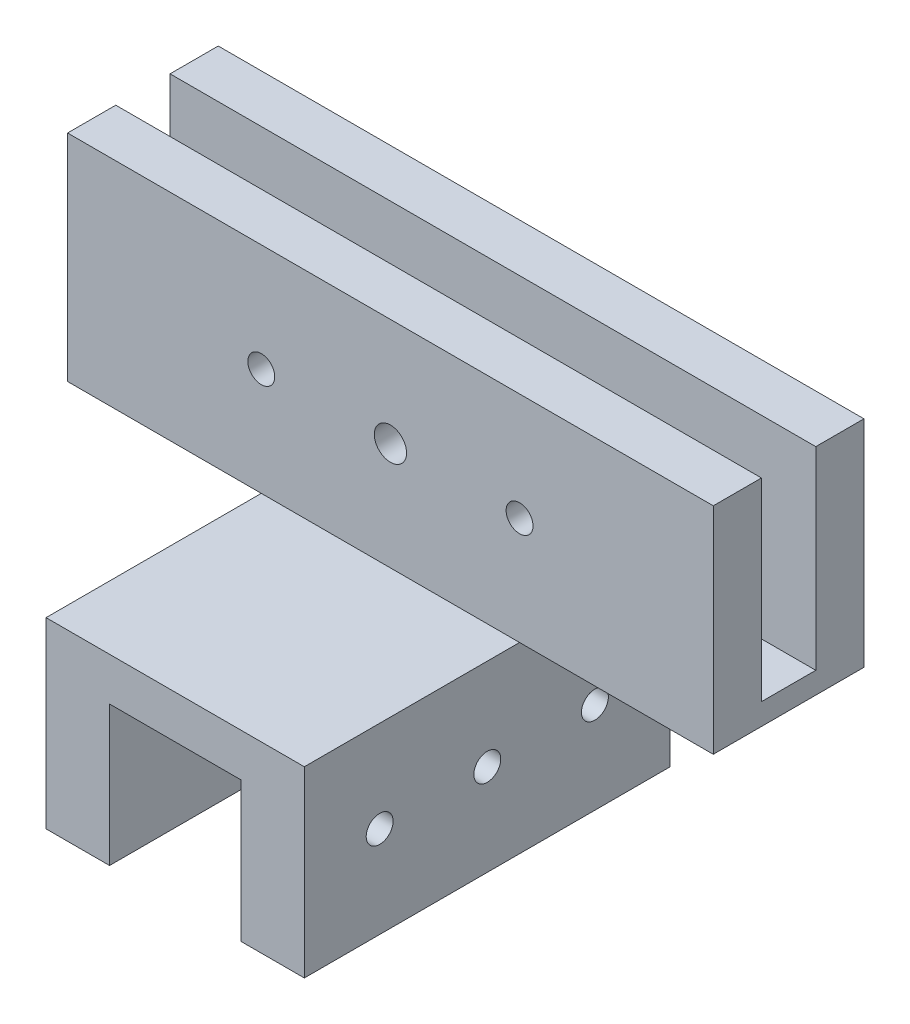
ISO-10303-21;
HEADER;
FILE_DESCRIPTION(('STEP AP214'),'2;1');
FILE_NAME('part.step','',(''),(''),'','','');
FILE_SCHEMA(('AUTOMOTIVE_DESIGN { 1 0 10303 214 1 1 1 1 }'));
ENDSEC;
DATA;
#1=APPLICATION_CONTEXT('core data for automotive mechanical design processes');
#2=APPLICATION_PROTOCOL_DEFINITION('international standard','automotive_design',2000,#1);
#3=PRODUCT_CONTEXT('',#1,'mechanical');
#4=PRODUCT('Part','Part','',(#3));
#5=PRODUCT_RELATED_PRODUCT_CATEGORY('part','',(#4));
#6=PRODUCT_DEFINITION_FORMATION('','',#4);
#7=PRODUCT_DEFINITION_CONTEXT('part definition',#1,'design');
#8=PRODUCT_DEFINITION('design','',#6,#7);
#9=PRODUCT_DEFINITION_SHAPE('','',#8);
#10=(LENGTH_UNIT() NAMED_UNIT(*) SI_UNIT(.MILLI.,.METRE.));
#11=(NAMED_UNIT(*) PLANE_ANGLE_UNIT() SI_UNIT($,.RADIAN.));
#12=(NAMED_UNIT(*) SI_UNIT($,.STERADIAN.) SOLID_ANGLE_UNIT());
#13=UNCERTAINTY_MEASURE_WITH_UNIT(LENGTH_MEASURE(1.E-05),#10,'distance_accuracy_value','');
#14=(GEOMETRIC_REPRESENTATION_CONTEXT(3) GLOBAL_UNCERTAINTY_ASSIGNED_CONTEXT((#13)) GLOBAL_UNIT_ASSIGNED_CONTEXT((#10,
#11,#12)) REPRESENTATION_CONTEXT('',''));
#15=CARTESIAN_POINT('',(0.,0.,0.));
#16=DIRECTION('',(0.,0.,1.));
#17=DIRECTION('',(1.,0.,0.));
#18=AXIS2_PLACEMENT_3D('',#15,#16,#17);
#19=CARTESIAN_POINT('',(0.,0.,0.));
#20=DIRECTION('',(0.,0.,-1.));
#21=DIRECTION('',(-1.,0.,0.));
#22=AXIS2_PLACEMENT_3D('',#19,#20,#21);
#23=PLANE('',#22);
#24=CARTESIAN_POINT('',(0.,7.,0.));
#25=DIRECTION('',(0.,0.,1.));
#26=DIRECTION('',(1.,0.,0.));
#27=AXIS2_PLACEMENT_3D('',#24,#25,#26);
#28=CIRCLE('',#27,0.75);
#29=CARTESIAN_POINT('',(0.75,7.,0.));
#30=VERTEX_POINT('',#29);
#31=EDGE_CURVE('E663',#30,#30,#28,.T.);
#32=ORIENTED_EDGE('',*,*,#31,.F.);
#33=EDGE_LOOP('',(#32));
#34=FACE_BOUND('',#33,.T.);
#35=CARTESIAN_POINT('',(6.,7.,0.));
#36=DIRECTION('',(0.,0.,1.));
#37=DIRECTION('',(1.,0.,0.));
#38=AXIS2_PLACEMENT_3D('',#35,#36,#37);
#39=CIRCLE('',#38,0.625);
#40=CARTESIAN_POINT('',(6.625,7.,0.));
#41=VERTEX_POINT('',#40);
#42=EDGE_CURVE('E634',#41,#41,#39,.T.);
#43=ORIENTED_EDGE('',*,*,#42,.F.);
#44=EDGE_LOOP('',(#43));
#45=FACE_BOUND('',#44,.T.);
#46=DIRECTION('',(1.,0.,0.));
#47=VECTOR('',#46,1.);
#48=CARTESIAN_POINT('',(-15.,12.,0.));
#49=LINE('',#48,#47);
#50=CARTESIAN_POINT('',(-15.,12.,0.));
#51=VERTEX_POINT('',#50);
#52=CARTESIAN_POINT('',(15.,12.,0.));
#53=VERTEX_POINT('',#52);
#54=EDGE_CURVE('E190',#51,#53,#49,.T.);
#55=ORIENTED_EDGE('',*,*,#54,.F.);
#56=DIRECTION('',(0.,-1.,0.));
#57=VECTOR('',#56,1.);
#58=CARTESIAN_POINT('',(-15.,12.,0.));
#59=LINE('',#58,#57);
#60=CARTESIAN_POINT('',(-15.,1.99999999999999,0.));
#61=VERTEX_POINT('',#60);
#62=EDGE_CURVE('E199',#51,#61,#59,.T.);
#63=ORIENTED_EDGE('',*,*,#62,.T.);
#64=DIRECTION('',(1.,0.,0.));
#65=VECTOR('',#64,1.);
#66=CARTESIAN_POINT('',(-15.,1.99999999999999,0.));
#67=LINE('',#66,#65);
#68=CARTESIAN_POINT('',(-6.00000000000001,1.99999999999999,0.));
#69=VERTEX_POINT('',#68);
#70=EDGE_CURVE('E46',#61,#69,#67,.T.);
#71=ORIENTED_EDGE('',*,*,#70,.T.);
#72=CARTESIAN_POINT('',(6.,2.,0.));
#73=VERTEX_POINT('',#72);
#74=EDGE_CURVE('E11',#69,#73,#67,.T.);
#75=ORIENTED_EDGE('',*,*,#74,.T.);
#76=CARTESIAN_POINT('',(15.,2.,0.));
#77=VERTEX_POINT('',#76);
#78=EDGE_CURVE('E47',#73,#77,#67,.T.);
#79=ORIENTED_EDGE('',*,*,#78,.T.);
#80=DIRECTION('',(0.,-1.,0.));
#81=VECTOR('',#80,1.);
#82=CARTESIAN_POINT('',(15.,12.,0.));
#83=LINE('',#82,#81);
#84=EDGE_CURVE('E212',#53,#77,#83,.T.);
#85=ORIENTED_EDGE('',*,*,#84,.F.);
#86=EDGE_LOOP('',(#55,#63,#71,#75,#79,#85));
#87=FACE_BOUND('',#86,.T.);
#88=CARTESIAN_POINT('',(-6.00000000000001,7.,0.));
#89=DIRECTION('',(0.,0.,1.));
#90=DIRECTION('',(1.,0.,0.));
#91=AXIS2_PLACEMENT_3D('',#88,#89,#90);
#92=CIRCLE('',#91,0.625);
#93=CARTESIAN_POINT('',(-5.37500000000001,7.,0.));
#94=VERTEX_POINT('',#93);
#95=EDGE_CURVE('E631',#94,#94,#92,.T.);
#96=ORIENTED_EDGE('',*,*,#95,.F.);
#97=EDGE_LOOP('',(#96));
#98=FACE_BOUND('',#97,.T.);
#99=ADVANCED_FACE('F35',(#34,#45,#87,#98),#23,.F.);
#100=CARTESIAN_POINT('',(-15.,12.,-7.));
#101=DIRECTION('',(0.,-1.,0.));
#102=DIRECTION('',(1.,0.,0.));
#103=AXIS2_PLACEMENT_3D('',#100,#101,#102);
#104=PLANE('',#103);
#105=DIRECTION('',(0.,0.,1.));
#106=VECTOR('',#105,1.);
#107=CARTESIAN_POINT('',(-15.,12.,-7.));
#108=LINE('',#107,#106);
#109=CARTESIAN_POINT('',(-15.,12.,-7.));
#110=VERTEX_POINT('',#109);
#111=CARTESIAN_POINT('',(-15.,12.,-4.76148716506941));
#112=VERTEX_POINT('',#111);
#113=EDGE_CURVE('E218',#110,#112,#108,.T.);
#114=ORIENTED_EDGE('',*,*,#113,.T.);
#115=DIRECTION('',(-1.,0.,0.));
#116=VECTOR('',#115,1.);
#117=CARTESIAN_POINT('',(15.,12.,-4.76148716506941));
#118=LINE('',#117,#116);
#119=CARTESIAN_POINT('',(15.,12.,-4.76148716506941));
#120=VERTEX_POINT('',#119);
#121=EDGE_CURVE('E188',#120,#112,#118,.T.);
#122=ORIENTED_EDGE('',*,*,#121,.F.);
#123=DIRECTION('',(0.,0.,1.));
#124=VECTOR('',#123,1.);
#125=CARTESIAN_POINT('',(15.,12.,-7.));
#126=LINE('',#125,#124);
#127=CARTESIAN_POINT('',(15.,12.,-7.));
#128=VERTEX_POINT('',#127);
#129=EDGE_CURVE('E176',#128,#120,#126,.T.);
#130=ORIENTED_EDGE('',*,*,#129,.F.);
#131=DIRECTION('',(1.,0.,0.));
#132=VECTOR('',#131,1.);
#133=CARTESIAN_POINT('',(-15.,12.,-7.));
#134=LINE('',#133,#132);
#135=EDGE_CURVE('E195',#110,#128,#134,.T.);
#136=ORIENTED_EDGE('',*,*,#135,.F.);
#137=EDGE_LOOP('',(#114,#122,#130,#136));
#138=FACE_BOUND('',#137,.T.);
#139=ADVANCED_FACE('F340',(#138),#104,.F.);
#140=CARTESIAN_POINT('',(0.,1.99999999999999,-7.));
#141=DIRECTION('',(0.,-1.,0.));
#142=DIRECTION('',(0.,0.,-1.));
#143=AXIS2_PLACEMENT_3D('',#140,#141,#142);
#144=PLANE('',#143);
#145=ORIENTED_EDGE('',*,*,#74,.F.);
#146=DIRECTION('',(0.,0.,1.));
#147=VECTOR('',#146,1.);
#148=CARTESIAN_POINT('',(-6.00000000000001,1.99999999999999,-7.));
#149=LINE('',#148,#147);
#150=CARTESIAN_POINT('',(-6.00000000000001,1.99999999999999,10.));
#151=VERTEX_POINT('',#150);
#152=EDGE_CURVE('E270',#69,#151,#149,.T.);
#153=ORIENTED_EDGE('',*,*,#152,.T.);
#154=DIRECTION('',(1.,0.,0.));
#155=VECTOR('',#154,1.);
#156=CARTESIAN_POINT('',(0.,1.99999999999999,10.));
#157=LINE('',#156,#155);
#158=CARTESIAN_POINT('',(5.99999999999999,1.99999999999999,10.));
#159=VERTEX_POINT('',#158);
#160=EDGE_CURVE('E228',#151,#159,#157,.T.);
#161=ORIENTED_EDGE('',*,*,#160,.T.);
#162=DIRECTION('',(0.,0.,1.));
#163=VECTOR('',#162,1.);
#164=CARTESIAN_POINT('',(5.99999999999999,1.99999999999999,-7.));
#165=LINE('',#164,#163);
#166=EDGE_CURVE('E272',#73,#159,#165,.T.);
#167=ORIENTED_EDGE('',*,*,#166,.F.);
#168=EDGE_LOOP('',(#145,#153,#161,#167));
#169=FACE_BOUND('',#168,.T.);
#170=ADVANCED_FACE('F37',(#169),#144,.F.);
#171=CARTESIAN_POINT('',(5.99999999999999,0.,-7.));
#172=DIRECTION('',(1.,0.,0.));
#173=DIRECTION('',(0.,0.,-1.));
#174=AXIS2_PLACEMENT_3D('',#171,#172,#173);
#175=PLANE('',#174);
#176=CARTESIAN_POINT('',(6.,-2.25,-3.5));
#177=DIRECTION('',(1.,0.,0.));
#178=DIRECTION('',(0.,0.,-1.));
#179=AXIS2_PLACEMENT_3D('',#176,#177,#178);
#180=CIRCLE('',#179,0.624999999999988);
#181=CARTESIAN_POINT('',(6.,-2.25,-4.12499999999999));
#182=VERTEX_POINT('',#181);
#183=EDGE_CURVE('E654',#182,#182,#180,.T.);
#184=ORIENTED_EDGE('',*,*,#183,.F.);
#185=EDGE_LOOP('',(#184));
#186=FACE_BOUND('',#185,.T.);
#187=CARTESIAN_POINT('',(6.,-2.25,6.5));
#188=DIRECTION('',(1.,0.,0.));
#189=DIRECTION('',(0.,0.,-1.));
#190=AXIS2_PLACEMENT_3D('',#187,#188,#189);
#191=CIRCLE('',#190,0.624999999999988);
#192=CARTESIAN_POINT('',(6.,-2.25,5.87500000000001));
#193=VERTEX_POINT('',#192);
#194=EDGE_CURVE('E648',#193,#193,#191,.T.);
#195=ORIENTED_EDGE('',*,*,#194,.F.);
#196=EDGE_LOOP('',(#195));
#197=FACE_BOUND('',#196,.T.);
#198=CARTESIAN_POINT('',(6.,-2.25,1.5));
#199=DIRECTION('',(1.,0.,0.));
#200=DIRECTION('',(0.,0.,-1.));
#201=AXIS2_PLACEMENT_3D('',#198,#199,#200);
#202=CIRCLE('',#201,0.624999999999988);
#203=CARTESIAN_POINT('',(6.,-2.25,0.875000000000013));
#204=VERTEX_POINT('',#203);
#205=EDGE_CURVE('E642',#204,#204,#202,.T.);
#206=ORIENTED_EDGE('',*,*,#205,.F.);
#207=EDGE_LOOP('',(#206));
#208=FACE_BOUND('',#207,.T.);
#209=CARTESIAN_POINT('',(5.99999999999999,1.99999999999999,-7.));
#210=VERTEX_POINT('',#209);
#211=EDGE_CURVE('E44',#210,#73,#165,.T.);
#212=ORIENTED_EDGE('',*,*,#211,.T.);
#213=ORIENTED_EDGE('',*,*,#166,.T.);
#214=DIRECTION('',(0.,1.,0.));
#215=VECTOR('',#214,1.);
#216=CARTESIAN_POINT('',(5.99999999999999,0.,10.));
#217=LINE('',#216,#215);
#218=CARTESIAN_POINT('',(5.99999999999999,-6.49999999999999,10.));
#219=VERTEX_POINT('',#218);
#220=EDGE_CURVE('E249',#219,#159,#217,.T.);
#221=ORIENTED_EDGE('',*,*,#220,.F.);
#222=DIRECTION('',(0.,0.,1.));
#223=VECTOR('',#222,1.);
#224=CARTESIAN_POINT('',(5.99999999999999,-6.49999999999999,-7.));
#225=LINE('',#224,#223);
#226=CARTESIAN_POINT('',(5.99999999999999,-6.49999999999999,-7.));
#227=VERTEX_POINT('',#226);
#228=EDGE_CURVE('E273',#227,#219,#225,.T.);
#229=ORIENTED_EDGE('',*,*,#228,.F.);
#230=DIRECTION('',(0.,1.,0.));
#231=VECTOR('',#230,1.);
#232=CARTESIAN_POINT('',(5.99999999999999,0.,-7.));
#233=LINE('',#232,#231);
#234=EDGE_CURVE('E268',#227,#210,#233,.T.);
#235=ORIENTED_EDGE('',*,*,#234,.T.);
#236=EDGE_LOOP('',(#212,#213,#221,#229,#235));
#237=FACE_BOUND('',#236,.T.);
#238=ADVANCED_FACE('F321',(#186,#197,#208,#237),#175,.T.);
#239=CARTESIAN_POINT('',(0.,-6.49999999999999,-7.));
#240=DIRECTION('',(0.,-1.,0.));
#241=DIRECTION('',(1.,0.,0.));
#242=AXIS2_PLACEMENT_3D('',#239,#240,#241);
#243=PLANE('',#242);
#244=ORIENTED_EDGE('',*,*,#228,.T.);
#245=DIRECTION('',(1.,0.,0.));
#246=VECTOR('',#245,1.);
#247=CARTESIAN_POINT('',(0.,-6.49999999999999,10.));
#248=LINE('',#247,#246);
#249=CARTESIAN_POINT('',(3.04999999999999,-6.49999999999999,10.));
#250=VERTEX_POINT('',#249);
#251=EDGE_CURVE('E246',#250,#219,#248,.T.);
#252=ORIENTED_EDGE('',*,*,#251,.F.);
#253=DIRECTION('',(0.,0.,1.));
#254=VECTOR('',#253,1.);
#255=CARTESIAN_POINT('',(3.04999999999999,-6.49999999999999,-7.));
#256=LINE('',#255,#254);
#257=CARTESIAN_POINT('',(3.04999999999999,-6.49999999999999,-7.));
#258=VERTEX_POINT('',#257);
#259=EDGE_CURVE('E275',#258,#250,#256,.T.);
#260=ORIENTED_EDGE('',*,*,#259,.F.);
#261=DIRECTION('',(1.,0.,0.));
#262=VECTOR('',#261,1.);
#263=CARTESIAN_POINT('',(0.,-6.49999999999999,-7.));
#264=LINE('',#263,#262);
#265=EDGE_CURVE('E265',#258,#227,#264,.T.);
#266=ORIENTED_EDGE('',*,*,#265,.T.);
#267=EDGE_LOOP('',(#244,#252,#260,#266));
#268=FACE_BOUND('',#267,.T.);
#269=ADVANCED_FACE('F386',(#268),#243,.T.);
#270=CARTESIAN_POINT('',(3.04999999999999,0.,-7.));
#271=DIRECTION('',(1.,0.,0.));
#272=DIRECTION('',(0.,1.,0.));
#273=AXIS2_PLACEMENT_3D('',#270,#271,#272);
#274=PLANE('',#273);
#275=CARTESIAN_POINT('',(3.04999999999999,-2.25,-3.5));
#276=DIRECTION('',(1.,0.,0.));
#277=DIRECTION('',(0.,1.,0.));
#278=AXIS2_PLACEMENT_3D('',#275,#276,#277);
#279=CIRCLE('',#278,0.624999999999994);
#280=CARTESIAN_POINT('',(3.04999999999999,-1.625,-3.5));
#281=VERTEX_POINT('',#280);
#282=EDGE_CURVE('E651',#281,#281,#279,.T.);
#283=ORIENTED_EDGE('',*,*,#282,.T.);
#284=EDGE_LOOP('',(#283));
#285=FACE_BOUND('',#284,.T.);
#286=CARTESIAN_POINT('',(3.04999999999999,-2.25,6.5));
#287=DIRECTION('',(1.,0.,0.));
#288=DIRECTION('',(0.,1.,0.));
#289=AXIS2_PLACEMENT_3D('',#286,#287,#288);
#290=CIRCLE('',#289,0.624999999999994);
#291=CARTESIAN_POINT('',(3.04999999999999,-1.625,6.5));
#292=VERTEX_POINT('',#291);
#293=EDGE_CURVE('E645',#292,#292,#290,.T.);
#294=ORIENTED_EDGE('',*,*,#293,.T.);
#295=EDGE_LOOP('',(#294));
#296=FACE_BOUND('',#295,.T.);
#297=CARTESIAN_POINT('',(3.04999999999999,-2.25,1.5));
#298=DIRECTION('',(1.,0.,0.));
#299=DIRECTION('',(0.,1.,0.));
#300=AXIS2_PLACEMENT_3D('',#297,#298,#299);
#301=CIRCLE('',#300,0.624999999999994);
#302=CARTESIAN_POINT('',(3.04999999999999,-1.625,1.5));
#303=VERTEX_POINT('',#302);
#304=EDGE_CURVE('E639',#303,#303,#301,.T.);
#305=ORIENTED_EDGE('',*,*,#304,.T.);
#306=EDGE_LOOP('',(#305));
#307=FACE_BOUND('',#306,.T.);
#308=ORIENTED_EDGE('',*,*,#259,.T.);
#309=DIRECTION('',(0.,1.,0.));
#310=VECTOR('',#309,1.);
#311=CARTESIAN_POINT('',(3.04999999999999,0.,10.));
#312=LINE('',#311,#310);
#313=CARTESIAN_POINT('',(3.04999999999999,0.,10.));
#314=VERTEX_POINT('',#313);
#315=EDGE_CURVE('E243',#250,#314,#312,.T.);
#316=ORIENTED_EDGE('',*,*,#315,.T.);
#317=DIRECTION('',(0.,0.,1.));
#318=VECTOR('',#317,1.);
#319=CARTESIAN_POINT('',(3.04999999999999,0.,-7.));
#320=LINE('',#319,#318);
#321=CARTESIAN_POINT('',(3.04999999999999,0.,-7.));
#322=VERTEX_POINT('',#321);
#323=EDGE_CURVE('E277',#322,#314,#320,.T.);
#324=ORIENTED_EDGE('',*,*,#323,.F.);
#325=DIRECTION('',(0.,1.,0.));
#326=VECTOR('',#325,1.);
#327=CARTESIAN_POINT('',(3.04999999999999,0.,-7.));
#328=LINE('',#327,#326);
#329=EDGE_CURVE('E263',#258,#322,#328,.T.);
#330=ORIENTED_EDGE('',*,*,#329,.F.);
#331=EDGE_LOOP('',(#308,#316,#324,#330));
#332=FACE_BOUND('',#331,.T.);
#333=ADVANCED_FACE('F316',(#285,#296,#307,#332),#274,.F.);
#334=CARTESIAN_POINT('',(0.,0.,-7.));
#335=DIRECTION('',(0.,-1.,0.));
#336=DIRECTION('',(0.,0.,-1.));
#337=AXIS2_PLACEMENT_3D('',#334,#335,#336);
#338=PLANE('',#337);
#339=ORIENTED_EDGE('',*,*,#323,.T.);
#340=DIRECTION('',(1.,0.,0.));
#341=VECTOR('',#340,1.);
#342=CARTESIAN_POINT('',(0.,0.,10.));
#343=LINE('',#342,#341);
#344=CARTESIAN_POINT('',(-3.05000000000001,0.,10.));
#345=VERTEX_POINT('',#344);
#346=EDGE_CURVE('E240',#345,#314,#343,.T.);
#347=ORIENTED_EDGE('',*,*,#346,.F.);
#348=DIRECTION('',(0.,0.,1.));
#349=VECTOR('',#348,1.);
#350=CARTESIAN_POINT('',(-3.05000000000001,0.,-7.));
#351=LINE('',#350,#349);
#352=CARTESIAN_POINT('',(-3.05000000000001,0.,-7.));
#353=VERTEX_POINT('',#352);
#354=EDGE_CURVE('E279',#353,#345,#351,.T.);
#355=ORIENTED_EDGE('',*,*,#354,.F.);
#356=DIRECTION('',(1.,0.,0.));
#357=VECTOR('',#356,1.);
#358=CARTESIAN_POINT('',(0.,0.,-7.));
#359=LINE('',#358,#357);
#360=EDGE_CURVE('E260',#353,#322,#359,.T.);
#361=ORIENTED_EDGE('',*,*,#360,.T.);
#362=EDGE_LOOP('',(#339,#347,#355,#361));
#363=FACE_BOUND('',#362,.T.);
#364=ADVANCED_FACE('F308',(#363),#338,.T.);
#365=CARTESIAN_POINT('',(-3.05,0.,-7.));
#366=DIRECTION('',(1.,0.,0.));
#367=DIRECTION('',(0.,1.,0.));
#368=AXIS2_PLACEMENT_3D('',#365,#366,#367);
#369=PLANE('',#368);
#370=ORIENTED_EDGE('',*,*,#354,.T.);
#371=DIRECTION('',(0.,1.,0.));
#372=VECTOR('',#371,1.);
#373=CARTESIAN_POINT('',(-3.05,0.,10.));
#374=LINE('',#373,#372);
#375=CARTESIAN_POINT('',(-3.05000000000001,-6.49999999999999,10.));
#376=VERTEX_POINT('',#375);
#377=EDGE_CURVE('E237',#376,#345,#374,.T.);
#378=ORIENTED_EDGE('',*,*,#377,.F.);
#379=DIRECTION('',(0.,0.,1.));
#380=VECTOR('',#379,1.);
#381=CARTESIAN_POINT('',(-3.05000000000001,-6.49999999999999,-7.));
#382=LINE('',#381,#380);
#383=CARTESIAN_POINT('',(-3.05000000000001,-6.49999999999999,-7.));
#384=VERTEX_POINT('',#383);
#385=EDGE_CURVE('E281',#384,#376,#382,.T.);
#386=ORIENTED_EDGE('',*,*,#385,.F.);
#387=DIRECTION('',(0.,1.,0.));
#388=VECTOR('',#387,1.);
#389=CARTESIAN_POINT('',(-3.05,0.,-7.));
#390=LINE('',#389,#388);
#391=EDGE_CURVE('E257',#384,#353,#390,.T.);
#392=ORIENTED_EDGE('',*,*,#391,.T.);
#393=EDGE_LOOP('',(#370,#378,#386,#392));
#394=FACE_BOUND('',#393,.T.);
#395=ADVANCED_FACE('F304',(#394),#369,.T.);
#396=CARTESIAN_POINT('',(0.,-6.49999999999999,-7.));
#397=DIRECTION('',(0.,-1.,0.));
#398=DIRECTION('',(1.,0.,0.));
#399=AXIS2_PLACEMENT_3D('',#396,#397,#398);
#400=PLANE('',#399);
#401=ORIENTED_EDGE('',*,*,#385,.T.);
#402=DIRECTION('',(1.,0.,0.));
#403=VECTOR('',#402,1.);
#404=CARTESIAN_POINT('',(0.,-6.49999999999999,10.));
#405=LINE('',#404,#403);
#406=CARTESIAN_POINT('',(-6.00000000000001,-6.49999999999999,10.));
#407=VERTEX_POINT('',#406);
#408=EDGE_CURVE('E234',#407,#376,#405,.T.);
#409=ORIENTED_EDGE('',*,*,#408,.F.);
#410=DIRECTION('',(0.,0.,1.));
#411=VECTOR('',#410,1.);
#412=CARTESIAN_POINT('',(-6.00000000000001,-6.49999999999999,-7.));
#413=LINE('',#412,#411);
#414=CARTESIAN_POINT('',(-6.00000000000001,-6.49999999999999,-7.));
#415=VERTEX_POINT('',#414);
#416=EDGE_CURVE('E283',#415,#407,#413,.T.);
#417=ORIENTED_EDGE('',*,*,#416,.F.);
#418=DIRECTION('',(1.,0.,0.));
#419=VECTOR('',#418,1.);
#420=CARTESIAN_POINT('',(0.,-6.49999999999999,-7.));
#421=LINE('',#420,#419);
#422=EDGE_CURVE('E254',#415,#384,#421,.T.);
#423=ORIENTED_EDGE('',*,*,#422,.T.);
#424=EDGE_LOOP('',(#401,#409,#417,#423));
#425=FACE_BOUND('',#424,.T.);
#426=ADVANCED_FACE('F300',(#425),#400,.T.);
#427=CARTESIAN_POINT('',(-6.00000000000001,0.,-7.));
#428=DIRECTION('',(1.,0.,0.));
#429=DIRECTION('',(0.,0.,-1.));
#430=AXIS2_PLACEMENT_3D('',#427,#428,#429);
#431=PLANE('',#430);
#432=ORIENTED_EDGE('',*,*,#416,.T.);
#433=DIRECTION('',(0.,1.,0.));
#434=VECTOR('',#433,1.);
#435=CARTESIAN_POINT('',(-6.00000000000001,0.,10.));
#436=LINE('',#435,#434);
#437=EDGE_CURVE('E231',#407,#151,#436,.T.);
#438=ORIENTED_EDGE('',*,*,#437,.T.);
#439=ORIENTED_EDGE('',*,*,#152,.F.);
#440=CARTESIAN_POINT('',(-6.00000000000001,1.99999999999999,-7.));
#441=VERTEX_POINT('',#440);
#442=EDGE_CURVE('E284',#441,#69,#149,.T.);
#443=ORIENTED_EDGE('',*,*,#442,.F.);
#444=DIRECTION('',(0.,1.,0.));
#445=VECTOR('',#444,1.);
#446=CARTESIAN_POINT('',(-6.00000000000001,0.,-7.));
#447=LINE('',#446,#445);
#448=EDGE_CURVE('E252',#415,#441,#447,.T.);
#449=ORIENTED_EDGE('',*,*,#448,.F.);
#450=EDGE_LOOP('',(#432,#438,#439,#443,#449));
#451=FACE_BOUND('',#450,.T.);
#452=ADVANCED_FACE('F295',(#451),#431,.F.);
#453=CARTESIAN_POINT('',(0.,0.,-7.));
#454=DIRECTION('',(0.,0.,1.));
#455=DIRECTION('',(1.,0.,0.));
#456=AXIS2_PLACEMENT_3D('',#453,#454,#455);
#457=PLANE('',#456);
#458=CARTESIAN_POINT('',(0.,7.,-7.));
#459=DIRECTION('',(0.,0.,1.));
#460=DIRECTION('',(1.,0.,0.));
#461=AXIS2_PLACEMENT_3D('',#458,#459,#460);
#462=CIRCLE('',#461,0.749999999999999);
#463=CARTESIAN_POINT('',(0.749999999999999,7.,-7.));
#464=VERTEX_POINT('',#463);
#465=EDGE_CURVE('E660',#464,#464,#462,.T.);
#466=ORIENTED_EDGE('',*,*,#465,.T.);
#467=EDGE_LOOP('',(#466));
#468=FACE_BOUND('',#467,.T.);
#469=ORIENTED_EDGE('',*,*,#448,.T.);
#470=DIRECTION('',(1.,0.,0.));
#471=VECTOR('',#470,1.);
#472=CARTESIAN_POINT('',(-15.,1.99999999999999,-7.));
#473=LINE('',#472,#471);
#474=CARTESIAN_POINT('',(-15.,1.99999999999999,-7.));
#475=VERTEX_POINT('',#474);
#476=EDGE_CURVE('E203',#475,#441,#473,.T.);
#477=ORIENTED_EDGE('',*,*,#476,.F.);
#478=DIRECTION('',(0.,-1.,0.));
#479=VECTOR('',#478,1.);
#480=CARTESIAN_POINT('',(-15.,12.,-7.));
#481=LINE('',#480,#479);
#482=EDGE_CURVE('E206',#110,#475,#481,.T.);
#483=ORIENTED_EDGE('',*,*,#482,.F.);
#484=ORIENTED_EDGE('',*,*,#135,.T.);
#485=DIRECTION('',(0.,-1.,0.));
#486=VECTOR('',#485,1.);
#487=CARTESIAN_POINT('',(15.,12.,-7.));
#488=LINE('',#487,#486);
#489=CARTESIAN_POINT('',(15.,2.,-7.));
#490=VERTEX_POINT('',#489);
#491=EDGE_CURVE('E198',#128,#490,#488,.T.);
#492=ORIENTED_EDGE('',*,*,#491,.T.);
#493=EDGE_CURVE('E202',#210,#490,#473,.T.);
#494=ORIENTED_EDGE('',*,*,#493,.F.);
#495=ORIENTED_EDGE('',*,*,#234,.F.);
#496=ORIENTED_EDGE('',*,*,#265,.F.);
#497=ORIENTED_EDGE('',*,*,#329,.T.);
#498=ORIENTED_EDGE('',*,*,#360,.F.);
#499=ORIENTED_EDGE('',*,*,#391,.F.);
#500=ORIENTED_EDGE('',*,*,#422,.F.);
#501=EDGE_LOOP('',(#469,#477,#483,#484,#492,#494,#495,#496,#497,#498,#499,#500));
#502=FACE_BOUND('',#501,.T.);
#503=ADVANCED_FACE('F310',(#468,#502),#457,.F.);
#504=CARTESIAN_POINT('',(0.,0.,10.));
#505=DIRECTION('',(0.,0.,1.));
#506=DIRECTION('',(1.,0.,0.));
#507=AXIS2_PLACEMENT_3D('',#504,#505,#506);
#508=PLANE('',#507);
#509=ORIENTED_EDGE('',*,*,#160,.F.);
#510=ORIENTED_EDGE('',*,*,#437,.F.);
#511=ORIENTED_EDGE('',*,*,#408,.T.);
#512=ORIENTED_EDGE('',*,*,#377,.T.);
#513=ORIENTED_EDGE('',*,*,#346,.T.);
#514=ORIENTED_EDGE('',*,*,#315,.F.);
#515=ORIENTED_EDGE('',*,*,#251,.T.);
#516=ORIENTED_EDGE('',*,*,#220,.T.);
#517=EDGE_LOOP('',(#509,#510,#511,#512,#513,#514,#515,#516));
#518=FACE_BOUND('',#517,.T.);
#519=ADVANCED_FACE('F293',(#518),#508,.T.);
#520=CARTESIAN_POINT('',(-15.,1.99999999999999,-7.));
#521=DIRECTION('',(0.,-1.,0.));
#522=DIRECTION('',(1.,0.,0.));
#523=AXIS2_PLACEMENT_3D('',#520,#521,#522);
#524=PLANE('',#523);
#525=ORIENTED_EDGE('',*,*,#211,.F.);
#526=ORIENTED_EDGE('',*,*,#493,.T.);
#527=DIRECTION('',(0.,0.,1.));
#528=VECTOR('',#527,1.);
#529=CARTESIAN_POINT('',(15.,2.,-7.));
#530=LINE('',#529,#528);
#531=EDGE_CURVE('E223',#490,#77,#530,.T.);
#532=ORIENTED_EDGE('',*,*,#531,.T.);
#533=ORIENTED_EDGE('',*,*,#78,.F.);
#534=EDGE_LOOP('',(#525,#526,#532,#533));
#535=FACE_BOUND('',#534,.T.);
#536=ADVANCED_FACE('F325',(#535),#524,.T.);
#537=CARTESIAN_POINT('',(15.,12.,-2.23851283493059));
#538=VERTEX_POINT('',#537);
#539=EDGE_CURVE('E226',#538,#53,#126,.T.);
#540=ORIENTED_EDGE('',*,*,#539,.F.);
#541=DIRECTION('',(-1.,0.,0.));
#542=VECTOR('',#541,1.);
#543=CARTESIAN_POINT('',(15.,12.,-2.23851283493059));
#544=LINE('',#543,#542);
#545=CARTESIAN_POINT('',(-15.,12.,-2.23851283493059));
#546=VERTEX_POINT('',#545);
#547=EDGE_CURVE('E191',#538,#546,#544,.T.);
#548=ORIENTED_EDGE('',*,*,#547,.T.);
#549=EDGE_CURVE('E209',#546,#51,#108,.T.);
#550=ORIENTED_EDGE('',*,*,#549,.T.);
#551=ORIENTED_EDGE('',*,*,#54,.T.);
#552=EDGE_LOOP('',(#540,#548,#550,#551));
#553=FACE_BOUND('',#552,.T.);
#554=ADVANCED_FACE('F343',(#553),#104,.F.);
#555=CARTESIAN_POINT('',(15.,12.,-7.));
#556=DIRECTION('',(-1.,0.,0.));
#557=DIRECTION('',(0.,-1.,0.));
#558=AXIS2_PLACEMENT_3D('',#555,#556,#557);
#559=PLANE('',#558);
#560=ORIENTED_EDGE('',*,*,#129,.T.);
#561=DIRECTION('',(0.,-1.,0.));
#562=VECTOR('',#561,1.);
#563=CARTESIAN_POINT('',(15.,12.,-4.76148716506941));
#564=LINE('',#563,#562);
#565=CARTESIAN_POINT('',(15.,3.00000000000001,-4.76148716506941));
#566=VERTEX_POINT('',#565);
#567=EDGE_CURVE('E158',#120,#566,#564,.T.);
#568=ORIENTED_EDGE('',*,*,#567,.T.);
#569=DIRECTION('',(0.,0.,1.));
#570=VECTOR('',#569,1.);
#571=CARTESIAN_POINT('',(15.,3.00000000000001,-2.23851283493059));
#572=LINE('',#571,#570);
#573=CARTESIAN_POINT('',(15.,3.00000000000001,-2.23851283493059));
#574=VERTEX_POINT('',#573);
#575=EDGE_CURVE('E167',#566,#574,#572,.T.);
#576=ORIENTED_EDGE('',*,*,#575,.T.);
#577=DIRECTION('',(0.,1.,0.));
#578=VECTOR('',#577,1.);
#579=CARTESIAN_POINT('',(15.,12.,-2.23851283493059));
#580=LINE('',#579,#578);
#581=EDGE_CURVE('E164',#574,#538,#580,.T.);
#582=ORIENTED_EDGE('',*,*,#581,.T.);
#583=ORIENTED_EDGE('',*,*,#539,.T.);
#584=ORIENTED_EDGE('',*,*,#84,.T.);
#585=ORIENTED_EDGE('',*,*,#531,.F.);
#586=ORIENTED_EDGE('',*,*,#491,.F.);
#587=EDGE_LOOP('',(#560,#568,#576,#582,#583,#584,#585,#586));
#588=FACE_BOUND('',#587,.T.);
#589=ADVANCED_FACE('F174',(#588),#559,.F.);
#590=ORIENTED_EDGE('',*,*,#476,.T.);
#591=ORIENTED_EDGE('',*,*,#442,.T.);
#592=ORIENTED_EDGE('',*,*,#70,.F.);
#593=DIRECTION('',(0.,0.,1.));
#594=VECTOR('',#593,1.);
#595=CARTESIAN_POINT('',(-15.,1.99999999999999,-7.));
#596=LINE('',#595,#594);
#597=EDGE_CURVE('E221',#475,#61,#596,.T.);
#598=ORIENTED_EDGE('',*,*,#597,.F.);
#599=EDGE_LOOP('',(#590,#591,#592,#598));
#600=FACE_BOUND('',#599,.T.);
#601=ADVANCED_FACE('F333',(#600),#524,.T.);
#602=CARTESIAN_POINT('',(-15.,12.,-7.));
#603=DIRECTION('',(-1.,0.,0.));
#604=DIRECTION('',(0.,-1.,0.));
#605=AXIS2_PLACEMENT_3D('',#602,#603,#604);
#606=PLANE('',#605);
#607=DIRECTION('',(0.,-1.,0.));
#608=VECTOR('',#607,1.);
#609=CARTESIAN_POINT('',(-15.,12.,-4.76148716506941));
#610=LINE('',#609,#608);
#611=CARTESIAN_POINT('',(-15.,2.99999999999999,-4.76148716506941));
#612=VERTEX_POINT('',#611);
#613=EDGE_CURVE('E54',#112,#612,#610,.T.);
#614=ORIENTED_EDGE('',*,*,#613,.F.);
#615=ORIENTED_EDGE('',*,*,#113,.F.);
#616=ORIENTED_EDGE('',*,*,#482,.T.);
#617=ORIENTED_EDGE('',*,*,#597,.T.);
#618=ORIENTED_EDGE('',*,*,#62,.F.);
#619=ORIENTED_EDGE('',*,*,#549,.F.);
#620=DIRECTION('',(0.,1.,0.));
#621=VECTOR('',#620,1.);
#622=CARTESIAN_POINT('',(-15.,12.,-2.23851283493059));
#623=LINE('',#622,#621);
#624=CARTESIAN_POINT('',(-15.,2.99999999999999,-2.23851283493059));
#625=VERTEX_POINT('',#624);
#626=EDGE_CURVE('E177',#625,#546,#623,.T.);
#627=ORIENTED_EDGE('',*,*,#626,.F.);
#628=DIRECTION('',(0.,0.,1.));
#629=VECTOR('',#628,1.);
#630=CARTESIAN_POINT('',(-15.,2.99999999999999,-2.23851283493059));
#631=LINE('',#630,#629);
#632=EDGE_CURVE('E179',#612,#625,#631,.T.);
#633=ORIENTED_EDGE('',*,*,#632,.F.);
#634=EDGE_LOOP('',(#614,#615,#616,#617,#618,#619,#627,#633));
#635=FACE_BOUND('',#634,.T.);
#636=ADVANCED_FACE('F337',(#635),#606,.T.);
#637=CARTESIAN_POINT('',(15.,12.,-4.76148716506941));
#638=DIRECTION('',(0.,0.,-1.));
#639=DIRECTION('',(0.,1.,0.));
#640=AXIS2_PLACEMENT_3D('',#637,#638,#639);
#641=PLANE('',#640);
#642=CARTESIAN_POINT('',(0.,7.,-4.76148716506941));
#643=DIRECTION('',(0.,0.,-1.));
#644=DIRECTION('',(0.,1.,0.));
#645=AXIS2_PLACEMENT_3D('',#642,#643,#644);
#646=CIRCLE('',#645,0.749999999999999);
#647=CARTESIAN_POINT('',(0.,7.75,-4.76148716506941));
#648=VERTEX_POINT('',#647);
#649=EDGE_CURVE('E657',#648,#648,#646,.T.);
#650=ORIENTED_EDGE('',*,*,#649,.T.);
#651=EDGE_LOOP('',(#650));
#652=FACE_BOUND('',#651,.T.);
#653=ORIENTED_EDGE('',*,*,#613,.T.);
#654=DIRECTION('',(-1.,0.,0.));
#655=VECTOR('',#654,1.);
#656=CARTESIAN_POINT('',(15.,3.00000000000001,-4.76148716506941));
#657=LINE('',#656,#655);
#658=EDGE_CURVE('E154',#566,#612,#657,.T.);
#659=ORIENTED_EDGE('',*,*,#658,.F.);
#660=ORIENTED_EDGE('',*,*,#567,.F.);
#661=ORIENTED_EDGE('',*,*,#121,.T.);
#662=EDGE_LOOP('',(#653,#659,#660,#661));
#663=FACE_BOUND('',#662,.T.);
#664=ADVANCED_FACE('F156',(#652,#663),#641,.F.);
#665=CARTESIAN_POINT('',(15.,12.,-2.23851283493059));
#666=DIRECTION('',(0.,0.,1.));
#667=DIRECTION('',(0.,-1.,0.));
#668=AXIS2_PLACEMENT_3D('',#665,#666,#667);
#669=PLANE('',#668);
#670=CARTESIAN_POINT('',(0.,7.,-2.23851283493059));
#671=DIRECTION('',(0.,0.,1.));
#672=DIRECTION('',(0.,-1.,0.));
#673=AXIS2_PLACEMENT_3D('',#670,#671,#672);
#674=CIRCLE('',#673,0.749999999999999);
#675=CARTESIAN_POINT('',(0.,6.25,-2.23851283493059));
#676=VERTEX_POINT('',#675);
#677=EDGE_CURVE('E39',#676,#676,#674,.T.);
#678=ORIENTED_EDGE('',*,*,#677,.T.);
#679=EDGE_LOOP('',(#678));
#680=FACE_BOUND('',#679,.T.);
#681=CARTESIAN_POINT('',(6.,7.,-2.23851283493059));
#682=DIRECTION('',(0.,0.,1.));
#683=DIRECTION('',(0.,-1.,0.));
#684=AXIS2_PLACEMENT_3D('',#681,#682,#683);
#685=CIRCLE('',#684,0.625);
#686=CARTESIAN_POINT('',(6.,6.375,-2.23851283493059));
#687=VERTEX_POINT('',#686);
#688=EDGE_CURVE('E632',#687,#687,#685,.T.);
#689=ORIENTED_EDGE('',*,*,#688,.T.);
#690=EDGE_LOOP('',(#689));
#691=FACE_BOUND('',#690,.T.);
#692=CARTESIAN_POINT('',(-6.00000000000001,7.,-2.23851283493059));
#693=DIRECTION('',(0.,0.,1.));
#694=DIRECTION('',(0.,-1.,0.));
#695=AXIS2_PLACEMENT_3D('',#692,#693,#694);
#696=CIRCLE('',#695,0.625);
#697=CARTESIAN_POINT('',(-6.00000000000001,6.375,-2.23851283493059));
#698=VERTEX_POINT('',#697);
#699=EDGE_CURVE('E182',#698,#698,#696,.T.);
#700=ORIENTED_EDGE('',*,*,#699,.T.);
#701=EDGE_LOOP('',(#700));
#702=FACE_BOUND('',#701,.T.);
#703=ORIENTED_EDGE('',*,*,#626,.T.);
#704=ORIENTED_EDGE('',*,*,#547,.F.);
#705=ORIENTED_EDGE('',*,*,#581,.F.);
#706=DIRECTION('',(-1.,0.,0.));
#707=VECTOR('',#706,1.);
#708=CARTESIAN_POINT('',(15.,3.00000000000001,-2.23851283493059));
#709=LINE('',#708,#707);
#710=EDGE_CURVE('E163',#574,#625,#709,.T.);
#711=ORIENTED_EDGE('',*,*,#710,.T.);
#712=EDGE_LOOP('',(#703,#704,#705,#711));
#713=FACE_BOUND('',#712,.T.);
#714=ADVANCED_FACE('F347',(#680,#691,#702,#713),#669,.F.);
#715=CARTESIAN_POINT('',(15.,3.00000000000001,-2.23851283493059));
#716=DIRECTION('',(0.,-1.,0.));
#717=DIRECTION('',(1.,0.,0.));
#718=AXIS2_PLACEMENT_3D('',#715,#716,#717);
#719=PLANE('',#718);
#720=ORIENTED_EDGE('',*,*,#632,.T.);
#721=ORIENTED_EDGE('',*,*,#710,.F.);
#722=ORIENTED_EDGE('',*,*,#575,.F.);
#723=ORIENTED_EDGE('',*,*,#658,.T.);
#724=EDGE_LOOP('',(#720,#721,#722,#723));
#725=FACE_BOUND('',#724,.T.);
#726=ADVANCED_FACE('F168',(#725),#719,.F.);
#727=CARTESIAN_POINT('',(-6.00000000000001,7.,0.));
#728=DIRECTION('',(0.,0.,1.));
#729=DIRECTION('',(1.,0.,0.));
#730=AXIS2_PLACEMENT_3D('',#727,#728,#729);
#731=CYLINDRICAL_SURFACE('',#730,0.625);
#732=ORIENTED_EDGE('',*,*,#699,.F.);
#733=EDGE_LOOP('',(#732));
#734=FACE_BOUND('',#733,.T.);
#735=ORIENTED_EDGE('',*,*,#95,.T.);
#736=EDGE_LOOP('',(#735));
#737=FACE_BOUND('',#736,.T.);
#738=ADVANCED_FACE('F355',(#734,#737),#731,.F.);
#739=CARTESIAN_POINT('',(6.,7.,0.));
#740=DIRECTION('',(0.,0.,1.));
#741=DIRECTION('',(1.,0.,0.));
#742=AXIS2_PLACEMENT_3D('',#739,#740,#741);
#743=CYLINDRICAL_SURFACE('',#742,0.625);
#744=ORIENTED_EDGE('',*,*,#688,.F.);
#745=EDGE_LOOP('',(#744));
#746=FACE_BOUND('',#745,.T.);
#747=ORIENTED_EDGE('',*,*,#42,.T.);
#748=EDGE_LOOP('',(#747));
#749=FACE_BOUND('',#748,.T.);
#750=ADVANCED_FACE('F493',(#746,#749),#743,.F.);
#751=CARTESIAN_POINT('',(5.99999999999999,-2.25,1.5));
#752=DIRECTION('',(1.,0.,0.));
#753=DIRECTION('',(0.,0.,-1.));
#754=AXIS2_PLACEMENT_3D('',#751,#752,#753);
#755=CYLINDRICAL_SURFACE('',#754,0.624999999999994);
#756=ORIENTED_EDGE('',*,*,#304,.F.);
#757=EDGE_LOOP('',(#756));
#758=FACE_BOUND('',#757,.T.);
#759=ORIENTED_EDGE('',*,*,#205,.T.);
#760=EDGE_LOOP('',(#759));
#761=FACE_BOUND('',#760,.T.);
#762=ADVANCED_FACE('F486',(#758,#761),#755,.F.);
#763=CARTESIAN_POINT('',(5.99999999999999,-2.25,6.5));
#764=DIRECTION('',(1.,0.,0.));
#765=DIRECTION('',(0.,0.,-1.));
#766=AXIS2_PLACEMENT_3D('',#763,#764,#765);
#767=CYLINDRICAL_SURFACE('',#766,0.624999999999994);
#768=ORIENTED_EDGE('',*,*,#293,.F.);
#769=EDGE_LOOP('',(#768));
#770=FACE_BOUND('',#769,.T.);
#771=ORIENTED_EDGE('',*,*,#194,.T.);
#772=EDGE_LOOP('',(#771));
#773=FACE_BOUND('',#772,.T.);
#774=ADVANCED_FACE('F477',(#770,#773),#767,.F.);
#775=CARTESIAN_POINT('',(5.99999999999999,-2.25,-3.5));
#776=DIRECTION('',(1.,0.,0.));
#777=DIRECTION('',(0.,0.,-1.));
#778=AXIS2_PLACEMENT_3D('',#775,#776,#777);
#779=CYLINDRICAL_SURFACE('',#778,0.624999999999994);
#780=ORIENTED_EDGE('',*,*,#282,.F.);
#781=EDGE_LOOP('',(#780));
#782=FACE_BOUND('',#781,.T.);
#783=ORIENTED_EDGE('',*,*,#183,.T.);
#784=EDGE_LOOP('',(#783));
#785=FACE_BOUND('',#784,.T.);
#786=ADVANCED_FACE('F457',(#782,#785),#779,.F.);
#787=CARTESIAN_POINT('',(0.,7.,0.));
#788=DIRECTION('',(0.,0.,1.));
#789=DIRECTION('',(1.,0.,0.));
#790=AXIS2_PLACEMENT_3D('',#787,#788,#789);
#791=CYLINDRICAL_SURFACE('',#790,0.749999999999999);
#792=ORIENTED_EDGE('',*,*,#31,.T.);
#793=EDGE_LOOP('',(#792));
#794=FACE_BOUND('',#793,.T.);
#795=ORIENTED_EDGE('',*,*,#677,.F.);
#796=EDGE_LOOP('',(#795));
#797=FACE_BOUND('',#796,.T.);
#798=ADVANCED_FACE('F450',(#794,#797),#791,.F.);
#799=ORIENTED_EDGE('',*,*,#465,.F.);
#800=EDGE_LOOP('',(#799));
#801=FACE_BOUND('',#800,.T.);
#802=ORIENTED_EDGE('',*,*,#649,.F.);
#803=EDGE_LOOP('',(#802));
#804=FACE_BOUND('',#803,.T.);
#805=ADVANCED_FACE('F456',(#801,#804),#791,.F.);
#806=CLOSED_SHELL('',(#99,#139,#170,#238,#269,#333,#364,#395,#426,#452,#503,#519,#536,#554,#589,
#601,#636,#664,#714,#726,#738,#750,#762,#774,#786,#798,#805));
#807=MANIFOLD_SOLID_BREP('B2',#806);
#808=ADVANCED_BREP_SHAPE_REPRESENTATION('',(#18,#807),#14);
#809=SHAPE_DEFINITION_REPRESENTATION(#9,#808);
ENDSEC;
END-ISO-10303-21;
